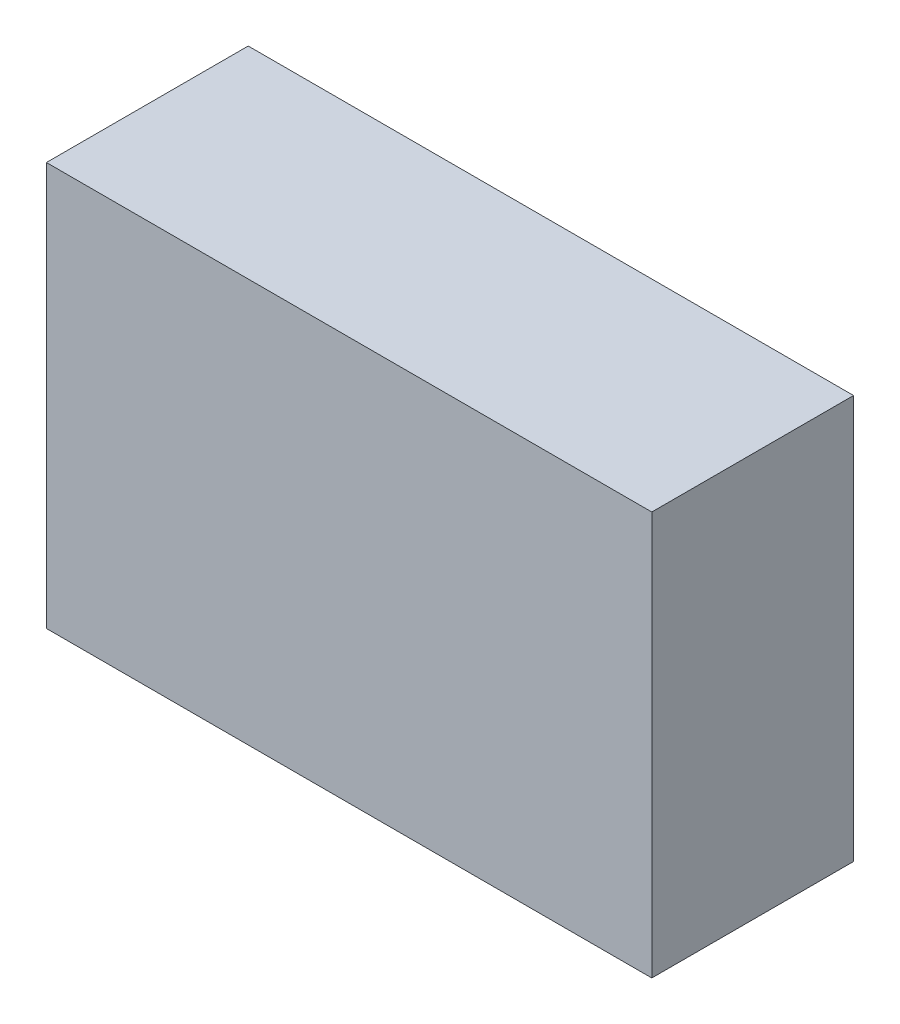
ISO-10303-21;
HEADER;
FILE_DESCRIPTION(('STEP AP214'),'2;1');
FILE_NAME('part.step','',(''),(''),'','','');
FILE_SCHEMA(('AUTOMOTIVE_DESIGN { 1 0 10303 214 1 1 1 1 }'));
ENDSEC;
DATA;
#1=APPLICATION_CONTEXT('core data for automotive mechanical design processes');
#2=APPLICATION_PROTOCOL_DEFINITION('international standard','automotive_design',2000,#1);
#3=PRODUCT_CONTEXT('',#1,'mechanical');
#4=PRODUCT('Part','Part','',(#3));
#5=PRODUCT_RELATED_PRODUCT_CATEGORY('part','',(#4));
#6=PRODUCT_DEFINITION_FORMATION('','',#4);
#7=PRODUCT_DEFINITION_CONTEXT('part definition',#1,'design');
#8=PRODUCT_DEFINITION('design','',#6,#7);
#9=PRODUCT_DEFINITION_SHAPE('','',#8);
#10=(LENGTH_UNIT() NAMED_UNIT(*) SI_UNIT(.MILLI.,.METRE.));
#11=(NAMED_UNIT(*) PLANE_ANGLE_UNIT() SI_UNIT($,.RADIAN.));
#12=(NAMED_UNIT(*) SI_UNIT($,.STERADIAN.) SOLID_ANGLE_UNIT());
#13=UNCERTAINTY_MEASURE_WITH_UNIT(LENGTH_MEASURE(1.E-05),#10,'distance_accuracy_value','');
#14=(GEOMETRIC_REPRESENTATION_CONTEXT(3) GLOBAL_UNCERTAINTY_ASSIGNED_CONTEXT((#13)) GLOBAL_UNIT_ASSIGNED_CONTEXT((#10,
#11,#12)) REPRESENTATION_CONTEXT('',''));
#15=CARTESIAN_POINT('',(0.,0.,0.));
#16=DIRECTION('',(0.,0.,1.));
#17=DIRECTION('',(1.,0.,0.));
#18=AXIS2_PLACEMENT_3D('',#15,#16,#17);
#19=CARTESIAN_POINT('',(-0.750000000000001,-0.5,0.5));
#20=DIRECTION('',(1.,0.,0.));
#21=DIRECTION('',(0.,0.,-1.));
#22=AXIS2_PLACEMENT_3D('',#19,#20,#21);
#23=PLANE('',#22);
#24=DIRECTION('',(0.,-1.,0.));
#25=VECTOR('',#24,1.);
#26=CARTESIAN_POINT('',(-0.750000000000001,-0.5,0.));
#27=LINE('',#26,#25);
#28=CARTESIAN_POINT('',(-0.750000000000001,0.5,0.));
#29=VERTEX_POINT('',#28);
#30=CARTESIAN_POINT('',(-0.750000000000001,-0.5,0.));
#31=VERTEX_POINT('',#30);
#32=EDGE_CURVE('E107',#29,#31,#27,.T.);
#33=ORIENTED_EDGE('',*,*,#32,.T.);
#34=DIRECTION('',(0.,0.,-1.));
#35=VECTOR('',#34,1.);
#36=CARTESIAN_POINT('',(-0.750000000000001,-0.5,0.5));
#37=LINE('',#36,#35);
#38=CARTESIAN_POINT('',(-0.750000000000001,-0.5,0.5));
#39=VERTEX_POINT('',#38);
#40=EDGE_CURVE('E11',#39,#31,#37,.T.);
#41=ORIENTED_EDGE('',*,*,#40,.F.);
#42=DIRECTION('',(0.,-1.,0.));
#43=VECTOR('',#42,1.);
#44=CARTESIAN_POINT('',(-0.750000000000001,-0.5,0.5));
#45=LINE('',#44,#43);
#46=CARTESIAN_POINT('',(-0.750000000000001,0.5,0.5));
#47=VERTEX_POINT('',#46);
#48=EDGE_CURVE('E91',#47,#39,#45,.T.);
#49=ORIENTED_EDGE('',*,*,#48,.F.);
#50=DIRECTION('',(0.,0.,-1.));
#51=VECTOR('',#50,1.);
#52=CARTESIAN_POINT('',(-0.750000000000001,0.5,0.5));
#53=LINE('',#52,#51);
#54=EDGE_CURVE('E103',#47,#29,#53,.T.);
#55=ORIENTED_EDGE('',*,*,#54,.T.);
#56=EDGE_LOOP('',(#33,#41,#49,#55));
#57=FACE_BOUND('',#56,.T.);
#58=ADVANCED_FACE('F39',(#57),#23,.F.);
#59=CARTESIAN_POINT('',(0.749999999999999,-0.5,0.5));
#60=DIRECTION('',(0.,1.,0.));
#61=DIRECTION('',(-1.,0.,0.));
#62=AXIS2_PLACEMENT_3D('',#59,#60,#61);
#63=PLANE('',#62);
#64=DIRECTION('',(1.,0.,0.));
#65=VECTOR('',#64,1.);
#66=CARTESIAN_POINT('',(0.749999999999999,-0.5,0.));
#67=LINE('',#66,#65);
#68=CARTESIAN_POINT('',(0.749999999999999,-0.5,0.));
#69=VERTEX_POINT('',#68);
#70=EDGE_CURVE('E96',#31,#69,#67,.T.);
#71=ORIENTED_EDGE('',*,*,#70,.T.);
#72=DIRECTION('',(0.,0.,-1.));
#73=VECTOR('',#72,1.);
#74=CARTESIAN_POINT('',(0.749999999999999,-0.5,0.5));
#75=LINE('',#74,#73);
#76=CARTESIAN_POINT('',(0.749999999999999,-0.5,0.5));
#77=VERTEX_POINT('',#76);
#78=EDGE_CURVE('E48',#77,#69,#75,.T.);
#79=ORIENTED_EDGE('',*,*,#78,.F.);
#80=DIRECTION('',(1.,0.,0.));
#81=VECTOR('',#80,1.);
#82=CARTESIAN_POINT('',(0.749999999999999,-0.5,0.5));
#83=LINE('',#82,#81);
#84=EDGE_CURVE('E86',#39,#77,#83,.T.);
#85=ORIENTED_EDGE('',*,*,#84,.F.);
#86=ORIENTED_EDGE('',*,*,#40,.T.);
#87=EDGE_LOOP('',(#71,#79,#85,#86));
#88=FACE_BOUND('',#87,.T.);
#89=ADVANCED_FACE('F95',(#88),#63,.F.);
#90=CARTESIAN_POINT('',(0.749999999999999,-0.5,0.5));
#91=DIRECTION('',(-1.,0.,0.));
#92=DIRECTION('',(0.,0.,1.));
#93=AXIS2_PLACEMENT_3D('',#90,#91,#92);
#94=PLANE('',#93);
#95=DIRECTION('',(0.,1.,0.));
#96=VECTOR('',#95,1.);
#97=CARTESIAN_POINT('',(0.749999999999999,-0.5,0.));
#98=LINE('',#97,#96);
#99=CARTESIAN_POINT('',(0.749999999999999,0.5,0.));
#100=VERTEX_POINT('',#99);
#101=EDGE_CURVE('E73',#69,#100,#98,.T.);
#102=ORIENTED_EDGE('',*,*,#101,.T.);
#103=DIRECTION('',(0.,0.,-1.));
#104=VECTOR('',#103,1.);
#105=CARTESIAN_POINT('',(0.749999999999999,0.5,0.5));
#106=LINE('',#105,#104);
#107=CARTESIAN_POINT('',(0.749999999999999,0.5,0.5));
#108=VERTEX_POINT('',#107);
#109=EDGE_CURVE('E98',#108,#100,#106,.T.);
#110=ORIENTED_EDGE('',*,*,#109,.F.);
#111=DIRECTION('',(0.,1.,0.));
#112=VECTOR('',#111,1.);
#113=CARTESIAN_POINT('',(0.749999999999999,-0.5,0.5));
#114=LINE('',#113,#112);
#115=EDGE_CURVE('E89',#77,#108,#114,.T.);
#116=ORIENTED_EDGE('',*,*,#115,.F.);
#117=ORIENTED_EDGE('',*,*,#78,.T.);
#118=EDGE_LOOP('',(#102,#110,#116,#117));
#119=FACE_BOUND('',#118,.T.);
#120=ADVANCED_FACE('F99',(#119),#94,.F.);
#121=CARTESIAN_POINT('',(0.749999999999999,0.5,0.5));
#122=DIRECTION('',(0.,-1.,0.));
#123=DIRECTION('',(1.,0.,0.));
#124=AXIS2_PLACEMENT_3D('',#121,#122,#123);
#125=PLANE('',#124);
#126=DIRECTION('',(-1.,0.,0.));
#127=VECTOR('',#126,1.);
#128=CARTESIAN_POINT('',(0.749999999999999,0.5,0.));
#129=LINE('',#128,#127);
#130=EDGE_CURVE('E79',#100,#29,#129,.T.);
#131=ORIENTED_EDGE('',*,*,#130,.T.);
#132=ORIENTED_EDGE('',*,*,#54,.F.);
#133=DIRECTION('',(-1.,0.,0.));
#134=VECTOR('',#133,1.);
#135=CARTESIAN_POINT('',(0.749999999999999,0.5,0.5));
#136=LINE('',#135,#134);
#137=EDGE_CURVE('E56',#108,#47,#136,.T.);
#138=ORIENTED_EDGE('',*,*,#137,.F.);
#139=ORIENTED_EDGE('',*,*,#109,.T.);
#140=EDGE_LOOP('',(#131,#132,#138,#139));
#141=FACE_BOUND('',#140,.T.);
#142=ADVANCED_FACE('F120',(#141),#125,.F.);
#143=CARTESIAN_POINT('',(0.,0.,0.5));
#144=DIRECTION('',(0.,0.,1.));
#145=DIRECTION('',(1.,0.,0.));
#146=AXIS2_PLACEMENT_3D('',#143,#144,#145);
#147=PLANE('',#146);
#148=ORIENTED_EDGE('',*,*,#48,.T.);
#149=ORIENTED_EDGE('',*,*,#84,.T.);
#150=ORIENTED_EDGE('',*,*,#115,.T.);
#151=ORIENTED_EDGE('',*,*,#137,.T.);
#152=EDGE_LOOP('',(#148,#149,#150,#151));
#153=FACE_BOUND('',#152,.T.);
#154=ADVANCED_FACE('F87',(#153),#147,.T.);
#155=CARTESIAN_POINT('',(0.,0.,0.));
#156=DIRECTION('',(0.,0.,1.));
#157=DIRECTION('',(1.,0.,0.));
#158=AXIS2_PLACEMENT_3D('',#155,#156,#157);
#159=PLANE('',#158);
#160=ORIENTED_EDGE('',*,*,#32,.F.);
#161=ORIENTED_EDGE('',*,*,#130,.F.);
#162=ORIENTED_EDGE('',*,*,#101,.F.);
#163=ORIENTED_EDGE('',*,*,#70,.F.);
#164=EDGE_LOOP('',(#160,#161,#162,#163));
#165=FACE_BOUND('',#164,.T.);
#166=ADVANCED_FACE('F123',(#165),#159,.F.);
#167=CLOSED_SHELL('',(#58,#89,#120,#142,#154,#166));
#168=MANIFOLD_SOLID_BREP('B2',#167);
#169=ADVANCED_BREP_SHAPE_REPRESENTATION('',(#18,#168),#14);
#170=SHAPE_DEFINITION_REPRESENTATION(#9,#169);
ENDSEC;
END-ISO-10303-21;
